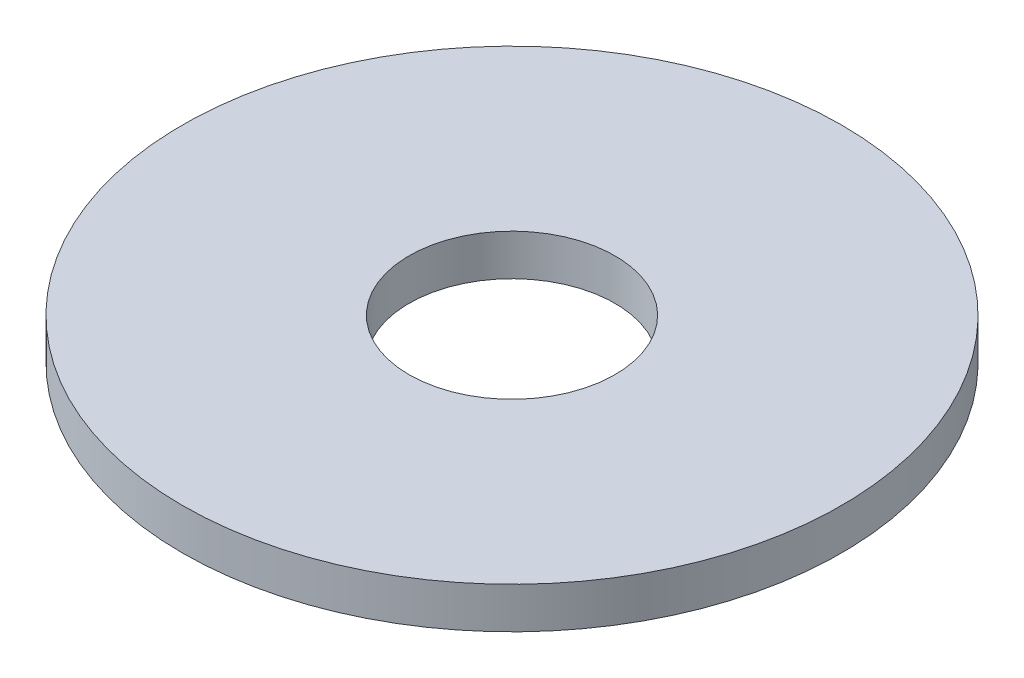
ISO-10303-21;
HEADER;
FILE_DESCRIPTION(('STEP AP214'),'2;1');
FILE_NAME('part.step','',(''),(''),'','','');
FILE_SCHEMA(('AUTOMOTIVE_DESIGN { 1 0 10303 214 1 1 1 1 }'));
ENDSEC;
DATA;
#1=APPLICATION_CONTEXT('core data for automotive mechanical design processes');
#2=APPLICATION_PROTOCOL_DEFINITION('international standard','automotive_design',2000,#1);
#3=PRODUCT_CONTEXT('',#1,'mechanical');
#4=PRODUCT('Part','Part','',(#3));
#5=PRODUCT_RELATED_PRODUCT_CATEGORY('part','',(#4));
#6=PRODUCT_DEFINITION_FORMATION('','',#4);
#7=PRODUCT_DEFINITION_CONTEXT('part definition',#1,'design');
#8=PRODUCT_DEFINITION('design','',#6,#7);
#9=PRODUCT_DEFINITION_SHAPE('','',#8);
#10=(LENGTH_UNIT() NAMED_UNIT(*) SI_UNIT(.MILLI.,.METRE.));
#11=(NAMED_UNIT(*) PLANE_ANGLE_UNIT() SI_UNIT($,.RADIAN.));
#12=(NAMED_UNIT(*) SI_UNIT($,.STERADIAN.) SOLID_ANGLE_UNIT());
#13=UNCERTAINTY_MEASURE_WITH_UNIT(LENGTH_MEASURE(1.E-05),#10,'distance_accuracy_value','');
#14=(GEOMETRIC_REPRESENTATION_CONTEXT(3) GLOBAL_UNCERTAINTY_ASSIGNED_CONTEXT((#13)) GLOBAL_UNIT_ASSIGNED_CONTEXT((#10,
#11,#12)) REPRESENTATION_CONTEXT('',''));
#15=CARTESIAN_POINT('',(0.,0.,0.));
#16=DIRECTION('',(0.,0.,1.));
#17=DIRECTION('',(1.,0.,0.));
#18=AXIS2_PLACEMENT_3D('',#15,#16,#17);
#19=CARTESIAN_POINT('',(0.,1.,0.));
#20=DIRECTION('',(0.,1.,0.));
#21=DIRECTION('',(0.,0.,1.));
#22=AXIS2_PLACEMENT_3D('',#19,#20,#21);
#23=PLANE('',#22);
#24=CARTESIAN_POINT('',(0.,1.,0.));
#25=DIRECTION('',(0.,1.,0.));
#26=DIRECTION('',(0.,0.,1.));
#27=AXIS2_PLACEMENT_3D('',#24,#25,#26);
#28=CIRCLE('',#27,2.5);
#29=CARTESIAN_POINT('',(0.,1.,2.5));
#30=VERTEX_POINT('',#29);
#31=EDGE_CURVE('E45',#30,#30,#28,.T.);
#32=ORIENTED_EDGE('',*,*,#31,.F.);
#33=EDGE_LOOP('',(#32));
#34=FACE_BOUND('',#33,.T.);
#35=CARTESIAN_POINT('',(0.,1.,0.));
#36=DIRECTION('',(0.,1.,0.));
#37=DIRECTION('',(0.,0.,1.));
#38=AXIS2_PLACEMENT_3D('',#35,#36,#37);
#39=CIRCLE('',#38,8.);
#40=CARTESIAN_POINT('',(0.,1.,8.));
#41=VERTEX_POINT('',#40);
#42=EDGE_CURVE('E10',#41,#41,#39,.T.);
#43=ORIENTED_EDGE('',*,*,#42,.T.);
#44=EDGE_LOOP('',(#43));
#45=FACE_BOUND('',#44,.T.);
#46=ADVANCED_FACE('F31',(#34,#45),#23,.T.);
#47=CARTESIAN_POINT('',(0.,0.,0.));
#48=DIRECTION('',(0.,1.,0.));
#49=DIRECTION('',(0.,0.,1.));
#50=AXIS2_PLACEMENT_3D('',#47,#48,#49);
#51=PLANE('',#50);
#52=CARTESIAN_POINT('',(0.,0.,0.));
#53=DIRECTION('',(0.,1.,0.));
#54=DIRECTION('',(0.,0.,1.));
#55=AXIS2_PLACEMENT_3D('',#52,#53,#54);
#56=CIRCLE('',#55,2.5);
#57=CARTESIAN_POINT('',(0.,0.,2.5));
#58=VERTEX_POINT('',#57);
#59=EDGE_CURVE('E35',#58,#58,#56,.T.);
#60=ORIENTED_EDGE('',*,*,#59,.T.);
#61=EDGE_LOOP('',(#60));
#62=FACE_BOUND('',#61,.T.);
#63=CARTESIAN_POINT('',(0.,0.,0.));
#64=DIRECTION('',(0.,1.,0.));
#65=DIRECTION('',(0.,0.,1.));
#66=AXIS2_PLACEMENT_3D('',#63,#64,#65);
#67=CIRCLE('',#66,8.);
#68=CARTESIAN_POINT('',(0.,0.,8.));
#69=VERTEX_POINT('',#68);
#70=EDGE_CURVE('E39',#69,#69,#67,.T.);
#71=ORIENTED_EDGE('',*,*,#70,.F.);
#72=EDGE_LOOP('',(#71));
#73=FACE_BOUND('',#72,.T.);
#74=ADVANCED_FACE('F52',(#62,#73),#51,.F.);
#75=CARTESIAN_POINT('',(0.,1.,0.));
#76=DIRECTION('',(0.,-1.,0.));
#77=DIRECTION('',(0.,0.,-1.));
#78=AXIS2_PLACEMENT_3D('',#75,#76,#77);
#79=CYLINDRICAL_SURFACE('',#78,8.);
#80=ORIENTED_EDGE('',*,*,#42,.F.);
#81=EDGE_LOOP('',(#80));
#82=FACE_BOUND('',#81,.T.);
#83=ORIENTED_EDGE('',*,*,#70,.T.);
#84=EDGE_LOOP('',(#83));
#85=FACE_BOUND('',#84,.T.);
#86=ADVANCED_FACE('F33',(#82,#85),#79,.T.);
#87=CARTESIAN_POINT('',(0.,-9.,0.));
#88=DIRECTION('',(0.,1.,0.));
#89=DIRECTION('',(0.,0.,1.));
#90=AXIS2_PLACEMENT_3D('',#87,#88,#89);
#91=CYLINDRICAL_SURFACE('',#90,2.5);
#92=ORIENTED_EDGE('',*,*,#31,.T.);
#93=EDGE_LOOP('',(#92));
#94=FACE_BOUND('',#93,.T.);
#95=ORIENTED_EDGE('',*,*,#59,.F.);
#96=EDGE_LOOP('',(#95));
#97=FACE_BOUND('',#96,.T.);
#98=ADVANCED_FACE('F55',(#94,#97),#91,.F.);
#99=CLOSED_SHELL('',(#46,#74,#86,#98));
#100=MANIFOLD_SOLID_BREP('B2',#99);
#101=ADVANCED_BREP_SHAPE_REPRESENTATION('',(#18,#100),#14);
#102=SHAPE_DEFINITION_REPRESENTATION(#9,#101);
ENDSEC;
END-ISO-10303-21;
